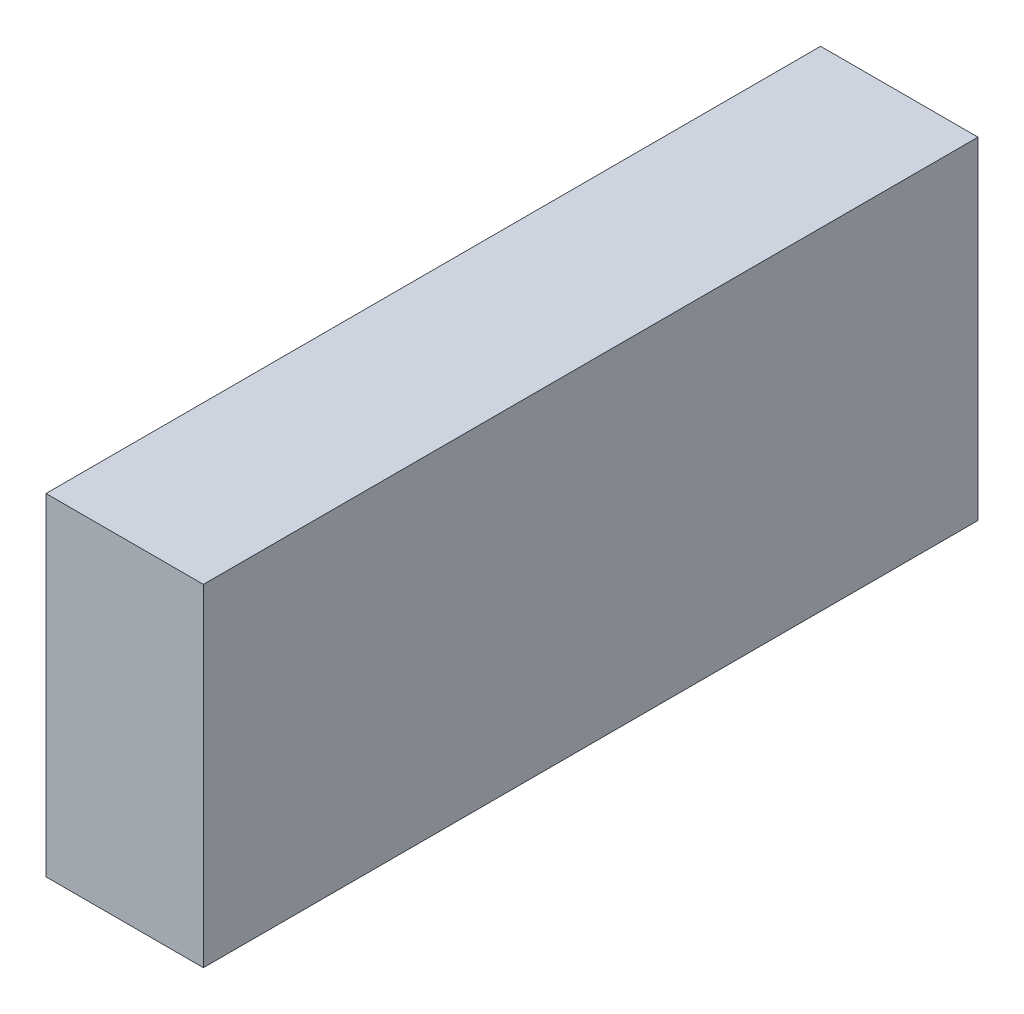
ISO-10303-21;
HEADER;
FILE_DESCRIPTION(('STEP AP214'),'2;1');
FILE_NAME('part.step','',(''),(''),'','','');
FILE_SCHEMA(('AUTOMOTIVE_DESIGN { 1 0 10303 214 1 1 1 1 }'));
ENDSEC;
DATA;
#1=APPLICATION_CONTEXT('core data for automotive mechanical design processes');
#2=APPLICATION_PROTOCOL_DEFINITION('international standard','automotive_design',2000,#1);
#3=PRODUCT_CONTEXT('',#1,'mechanical');
#4=PRODUCT('Part','Part','',(#3));
#5=PRODUCT_RELATED_PRODUCT_CATEGORY('part','',(#4));
#6=PRODUCT_DEFINITION_FORMATION('','',#4);
#7=PRODUCT_DEFINITION_CONTEXT('part definition',#1,'design');
#8=PRODUCT_DEFINITION('design','',#6,#7);
#9=PRODUCT_DEFINITION_SHAPE('','',#8);
#10=(LENGTH_UNIT() NAMED_UNIT(*) SI_UNIT(.MILLI.,.METRE.));
#11=(NAMED_UNIT(*) PLANE_ANGLE_UNIT() SI_UNIT($,.RADIAN.));
#12=(NAMED_UNIT(*) SI_UNIT($,.STERADIAN.) SOLID_ANGLE_UNIT());
#13=UNCERTAINTY_MEASURE_WITH_UNIT(LENGTH_MEASURE(1.E-05),#10,'distance_accuracy_value','');
#14=(GEOMETRIC_REPRESENTATION_CONTEXT(3) GLOBAL_UNCERTAINTY_ASSIGNED_CONTEXT((#13)) GLOBAL_UNIT_ASSIGNED_CONTEXT((#10,
#11,#12)) REPRESENTATION_CONTEXT('',''));
#15=CARTESIAN_POINT('',(0.,0.,0.));
#16=DIRECTION('',(0.,0.,1.));
#17=DIRECTION('',(1.,0.,0.));
#18=AXIS2_PLACEMENT_3D('',#15,#16,#17);
#19=CARTESIAN_POINT('',(-5.08,-10.715,25.));
#20=DIRECTION('',(1.,0.,0.));
#21=DIRECTION('',(0.,0.,-1.));
#22=AXIS2_PLACEMENT_3D('',#19,#20,#21);
#23=PLANE('',#22);
#24=DIRECTION('',(0.,-1.,0.));
#25=VECTOR('',#24,1.);
#26=CARTESIAN_POINT('',(-5.08,-10.715,-25.));
#27=LINE('',#26,#25);
#28=CARTESIAN_POINT('',(-5.08,10.715,-25.));
#29=VERTEX_POINT('',#28);
#30=CARTESIAN_POINT('',(-5.08,-10.715,-25.));
#31=VERTEX_POINT('',#30);
#32=EDGE_CURVE('E96',#29,#31,#27,.T.);
#33=ORIENTED_EDGE('',*,*,#32,.T.);
#34=DIRECTION('',(0.,0.,-1.));
#35=VECTOR('',#34,1.);
#36=CARTESIAN_POINT('',(-5.08,-10.715,25.));
#37=LINE('',#36,#35);
#38=CARTESIAN_POINT('',(-5.08,-10.715,25.));
#39=VERTEX_POINT('',#38);
#40=EDGE_CURVE('E11',#39,#31,#37,.T.);
#41=ORIENTED_EDGE('',*,*,#40,.F.);
#42=DIRECTION('',(0.,-1.,0.));
#43=VECTOR('',#42,1.);
#44=CARTESIAN_POINT('',(-5.08,-10.715,25.));
#45=LINE('',#44,#43);
#46=CARTESIAN_POINT('',(-5.08,10.715,25.));
#47=VERTEX_POINT('',#46);
#48=EDGE_CURVE('E84',#47,#39,#45,.T.);
#49=ORIENTED_EDGE('',*,*,#48,.F.);
#50=DIRECTION('',(0.,0.,-1.));
#51=VECTOR('',#50,1.);
#52=CARTESIAN_POINT('',(-5.08,10.715,25.));
#53=LINE('',#52,#51);
#54=EDGE_CURVE('E92',#47,#29,#53,.T.);
#55=ORIENTED_EDGE('',*,*,#54,.T.);
#56=EDGE_LOOP('',(#33,#41,#49,#55));
#57=FACE_BOUND('',#56,.T.);
#58=ADVANCED_FACE('F33',(#57),#23,.F.);
#59=CARTESIAN_POINT('',(5.08,-10.715,25.));
#60=DIRECTION('',(0.,1.,0.));
#61=DIRECTION('',(0.,0.,1.));
#62=AXIS2_PLACEMENT_3D('',#59,#60,#61);
#63=PLANE('',#62);
#64=DIRECTION('',(1.,0.,0.));
#65=VECTOR('',#64,1.);
#66=CARTESIAN_POINT('',(5.08,-10.715,-25.));
#67=LINE('',#66,#65);
#68=CARTESIAN_POINT('',(5.08,-10.715,-25.));
#69=VERTEX_POINT('',#68);
#70=EDGE_CURVE('E88',#31,#69,#67,.T.);
#71=ORIENTED_EDGE('',*,*,#70,.T.);
#72=DIRECTION('',(0.,0.,-1.));
#73=VECTOR('',#72,1.);
#74=CARTESIAN_POINT('',(5.08,-10.715,25.));
#75=LINE('',#74,#73);
#76=CARTESIAN_POINT('',(5.08,-10.715,25.));
#77=VERTEX_POINT('',#76);
#78=EDGE_CURVE('E41',#77,#69,#75,.T.);
#79=ORIENTED_EDGE('',*,*,#78,.F.);
#80=DIRECTION('',(1.,0.,0.));
#81=VECTOR('',#80,1.);
#82=CARTESIAN_POINT('',(5.08,-10.715,25.));
#83=LINE('',#82,#81);
#84=EDGE_CURVE('E79',#39,#77,#83,.T.);
#85=ORIENTED_EDGE('',*,*,#84,.F.);
#86=ORIENTED_EDGE('',*,*,#40,.T.);
#87=EDGE_LOOP('',(#71,#79,#85,#86));
#88=FACE_BOUND('',#87,.T.);
#89=ADVANCED_FACE('F87',(#88),#63,.F.);
#90=CARTESIAN_POINT('',(5.08,-10.715,25.));
#91=DIRECTION('',(-1.,0.,0.));
#92=DIRECTION('',(0.,0.,1.));
#93=AXIS2_PLACEMENT_3D('',#90,#91,#92);
#94=PLANE('',#93);
#95=DIRECTION('',(0.,1.,0.));
#96=VECTOR('',#95,1.);
#97=CARTESIAN_POINT('',(5.08,-10.715,-25.));
#98=LINE('',#97,#96);
#99=CARTESIAN_POINT('',(5.08,10.715,-25.));
#100=VERTEX_POINT('',#99);
#101=EDGE_CURVE('E66',#69,#100,#98,.T.);
#102=ORIENTED_EDGE('',*,*,#101,.T.);
#103=DIRECTION('',(0.,0.,-1.));
#104=VECTOR('',#103,1.);
#105=CARTESIAN_POINT('',(5.08,10.715,25.));
#106=LINE('',#105,#104);
#107=CARTESIAN_POINT('',(5.08,10.715,25.));
#108=VERTEX_POINT('',#107);
#109=EDGE_CURVE('E89',#108,#100,#106,.T.);
#110=ORIENTED_EDGE('',*,*,#109,.F.);
#111=DIRECTION('',(0.,1.,0.));
#112=VECTOR('',#111,1.);
#113=CARTESIAN_POINT('',(5.08,-10.715,25.));
#114=LINE('',#113,#112);
#115=EDGE_CURVE('E82',#77,#108,#114,.T.);
#116=ORIENTED_EDGE('',*,*,#115,.F.);
#117=ORIENTED_EDGE('',*,*,#78,.T.);
#118=EDGE_LOOP('',(#102,#110,#116,#117));
#119=FACE_BOUND('',#118,.T.);
#120=ADVANCED_FACE('F90',(#119),#94,.F.);
#121=CARTESIAN_POINT('',(5.08,10.715,25.));
#122=DIRECTION('',(0.,-1.,0.));
#123=DIRECTION('',(1.,0.,0.));
#124=AXIS2_PLACEMENT_3D('',#121,#122,#123);
#125=PLANE('',#124);
#126=DIRECTION('',(-1.,0.,0.));
#127=VECTOR('',#126,1.);
#128=CARTESIAN_POINT('',(5.08,10.715,-25.));
#129=LINE('',#128,#127);
#130=EDGE_CURVE('E72',#100,#29,#129,.T.);
#131=ORIENTED_EDGE('',*,*,#130,.T.);
#132=ORIENTED_EDGE('',*,*,#54,.F.);
#133=DIRECTION('',(-1.,0.,0.));
#134=VECTOR('',#133,1.);
#135=CARTESIAN_POINT('',(5.08,10.715,25.));
#136=LINE('',#135,#134);
#137=EDGE_CURVE('E49',#108,#47,#136,.T.);
#138=ORIENTED_EDGE('',*,*,#137,.F.);
#139=ORIENTED_EDGE('',*,*,#109,.T.);
#140=EDGE_LOOP('',(#131,#132,#138,#139));
#141=FACE_BOUND('',#140,.T.);
#142=ADVANCED_FACE('F103',(#141),#125,.F.);
#143=CARTESIAN_POINT('',(0.,0.,25.));
#144=DIRECTION('',(0.,0.,1.));
#145=DIRECTION('',(1.,0.,0.));
#146=AXIS2_PLACEMENT_3D('',#143,#144,#145);
#147=PLANE('',#146);
#148=ORIENTED_EDGE('',*,*,#48,.T.);
#149=ORIENTED_EDGE('',*,*,#84,.T.);
#150=ORIENTED_EDGE('',*,*,#115,.T.);
#151=ORIENTED_EDGE('',*,*,#137,.T.);
#152=EDGE_LOOP('',(#148,#149,#150,#151));
#153=FACE_BOUND('',#152,.T.);
#154=ADVANCED_FACE('F80',(#153),#147,.T.);
#155=CARTESIAN_POINT('',(0.,0.,-25.));
#156=DIRECTION('',(0.,0.,1.));
#157=DIRECTION('',(1.,0.,0.));
#158=AXIS2_PLACEMENT_3D('',#155,#156,#157);
#159=PLANE('',#158);
#160=ORIENTED_EDGE('',*,*,#32,.F.);
#161=ORIENTED_EDGE('',*,*,#130,.F.);
#162=ORIENTED_EDGE('',*,*,#101,.F.);
#163=ORIENTED_EDGE('',*,*,#70,.F.);
#164=EDGE_LOOP('',(#160,#161,#162,#163));
#165=FACE_BOUND('',#164,.T.);
#166=ADVANCED_FACE('F106',(#165),#159,.F.);
#167=CLOSED_SHELL('',(#58,#89,#120,#142,#154,#166));
#168=MANIFOLD_SOLID_BREP('B2',#167);
#169=ADVANCED_BREP_SHAPE_REPRESENTATION('',(#18,#168),#14);
#170=SHAPE_DEFINITION_REPRESENTATION(#9,#169);
ENDSEC;
END-ISO-10303-21;
